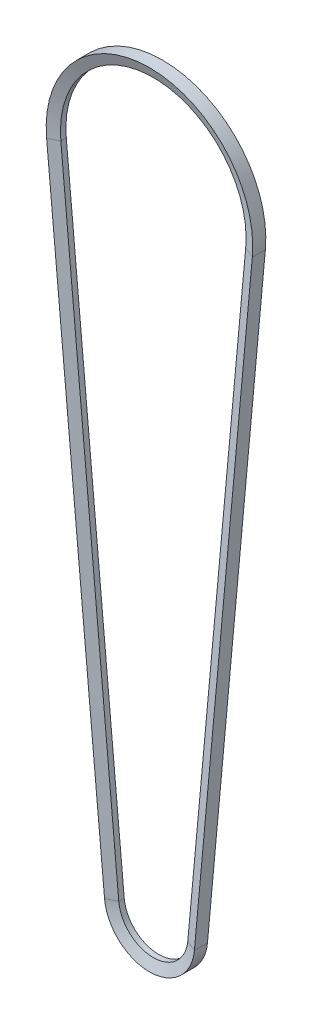
ISO-10303-21;
HEADER;
FILE_DESCRIPTION(('STEP AP214'),'2;1');
FILE_NAME('part.step','',(''),(''),'','','');
FILE_SCHEMA(('AUTOMOTIVE_DESIGN { 1 0 10303 214 1 1 1 1 }'));
ENDSEC;
DATA;
#1=APPLICATION_CONTEXT('core data for automotive mechanical design processes');
#2=APPLICATION_PROTOCOL_DEFINITION('international standard','automotive_design',2000,#1);
#3=PRODUCT_CONTEXT('',#1,'mechanical');
#4=PRODUCT('Part','Part','',(#3));
#5=PRODUCT_RELATED_PRODUCT_CATEGORY('part','',(#4));
#6=PRODUCT_DEFINITION_FORMATION('','',#4);
#7=PRODUCT_DEFINITION_CONTEXT('part definition',#1,'design');
#8=PRODUCT_DEFINITION('design','',#6,#7);
#9=PRODUCT_DEFINITION_SHAPE('','',#8);
#10=(LENGTH_UNIT() NAMED_UNIT(*) SI_UNIT(.MILLI.,.METRE.));
#11=(NAMED_UNIT(*) PLANE_ANGLE_UNIT() SI_UNIT($,.RADIAN.));
#12=(NAMED_UNIT(*) SI_UNIT($,.STERADIAN.) SOLID_ANGLE_UNIT());
#13=UNCERTAINTY_MEASURE_WITH_UNIT(LENGTH_MEASURE(1.E-05),#10,'distance_accuracy_value','');
#14=(GEOMETRIC_REPRESENTATION_CONTEXT(3) GLOBAL_UNCERTAINTY_ASSIGNED_CONTEXT((#13)) GLOBAL_UNIT_ASSIGNED_CONTEXT((#10,
#11,#12)) REPRESENTATION_CONTEXT('',''));
#15=CARTESIAN_POINT('',(0.,0.,0.));
#16=DIRECTION('',(0.,0.,1.));
#17=DIRECTION('',(1.,0.,0.));
#18=AXIS2_PLACEMENT_3D('',#15,#16,#17);
#19=CARTESIAN_POINT('',(-1.65201186064223E-10,485.500000000071,0.));
#20=DIRECTION('',(0.,0.,-1.));
#21=DIRECTION('',(-1.,0.,0.));
#22=AXIS2_PLACEMENT_3D('',#19,#20,#21);
#23=CYLINDRICAL_SURFACE('',#22,79.);
#24=CARTESIAN_POINT('',(-1.65201186064223E-10,485.500000000071,-5.));
#25=DIRECTION('',(0.,0.,-1.));
#26=DIRECTION('',(-0.995790537992341,-0.091658084449354,0.));
#27=AXIS2_PLACEMENT_3D('',#24,#25,#26);
#28=CIRCLE('',#27,79.);
#29=CARTESIAN_POINT('',(-78.6674525015601,478.259011328572,-5.));
#30=VERTEX_POINT('',#29);
#31=CARTESIAN_POINT('',(78.6674525012348,478.259011328628,-5.));
#32=VERTEX_POINT('',#31);
#33=EDGE_CURVE('E11',#30,#32,#28,.T.);
#34=ORIENTED_EDGE('',*,*,#33,.F.);
#35=DIRECTION('',(0.,0.,1.));
#36=VECTOR('',#35,1.);
#37=CARTESIAN_POINT('',(-78.6674525015601,478.259011328572,-5.));
#38=LINE('',#37,#36);
#39=CARTESIAN_POINT('',(-78.6674525015601,478.259011328572,5.));
#40=VERTEX_POINT('',#39);
#41=EDGE_CURVE('E36',#30,#40,#38,.T.);
#42=ORIENTED_EDGE('',*,*,#41,.T.);
#43=CARTESIAN_POINT('',(-1.65201186064223E-10,485.500000000071,5.));
#44=DIRECTION('',(0.,0.,-1.));
#45=DIRECTION('',(-0.995790537992341,-0.091658084449354,0.));
#46=AXIS2_PLACEMENT_3D('',#43,#44,#45);
#47=CIRCLE('',#46,79.);
#48=CARTESIAN_POINT('',(78.6674525012348,478.259011328628,5.));
#49=VERTEX_POINT('',#48);
#50=EDGE_CURVE('E118',#40,#49,#47,.T.);
#51=ORIENTED_EDGE('',*,*,#50,.T.);
#52=DIRECTION('',(0.,0.,1.));
#53=VECTOR('',#52,1.);
#54=CARTESIAN_POINT('',(78.6674525012348,478.259011328628,-5.));
#55=LINE('',#54,#53);
#56=EDGE_CURVE('E121',#32,#49,#55,.T.);
#57=ORIENTED_EDGE('',*,*,#56,.F.);
#58=EDGE_LOOP('',(#34,#42,#51,#57));
#59=FACE_BOUND('',#58,.T.);
#60=ADVANCED_FACE('F33',(#59),#23,.T.);
#61=CARTESIAN_POINT('',(-1.65201186064223E-10,485.500000000071,-2.08823812587041));
#62=DIRECTION('',(0.,0.,-1.));
#63=DIRECTION('',(-1.,0.,0.));
#64=AXIS2_PLACEMENT_3D('',#61,#62,#63);
#65=CONICAL_SURFACE('',#64,71.,1.22173047639603);
#66=CARTESIAN_POINT('',(-1.65201186064223E-10,485.500000000071,-2.08823812587041));
#67=DIRECTION('',(0.,0.,-1.));
#68=DIRECTION('',(-0.995790537992341,-0.0916580844493543,0.));
#69=AXIS2_PLACEMENT_3D('',#66,#67,#68);
#70=CIRCLE('',#69,71.);
#71=CARTESIAN_POINT('',(-70.7011281976214,478.992276004167,-2.08823812587041));
#72=VERTEX_POINT('',#71);
#73=CARTESIAN_POINT('',(70.7011281972955,478.992276004217,-2.08823812587041));
#74=VERTEX_POINT('',#73);
#75=EDGE_CURVE('E41',#72,#74,#70,.T.);
#76=ORIENTED_EDGE('',*,*,#75,.F.);
#77=DIRECTION('',(-0.935737020399833,-0.0861304255924296,-0.342020143325666));
#78=VECTOR('',#77,1.);
#79=CARTESIAN_POINT('',(-70.7011281976214,478.992276004167,-2.08823812587041));
#80=LINE('',#79,#78);
#81=EDGE_CURVE('E187',#72,#30,#80,.T.);
#82=ORIENTED_EDGE('',*,*,#81,.T.);
#83=ORIENTED_EDGE('',*,*,#33,.T.);
#84=DIRECTION('',(0.935737020399894,-0.0861304255917754,-0.342020143325666));
#85=VECTOR('',#84,1.);
#86=CARTESIAN_POINT('',(70.7011281972955,478.992276004217,-2.08823812587041));
#87=LINE('',#86,#85);
#88=EDGE_CURVE('E146',#74,#32,#87,.T.);
#89=ORIENTED_EDGE('',*,*,#88,.F.);
#90=EDGE_LOOP('',(#76,#82,#83,#89));
#91=FACE_BOUND('',#90,.T.);
#92=ADVANCED_FACE('F227',(#91),#65,.F.);
#93=CARTESIAN_POINT('',(-1.65201186064223E-10,485.500000000071,0.));
#94=DIRECTION('',(0.,0.,-1.));
#95=DIRECTION('',(-1.,0.,0.));
#96=AXIS2_PLACEMENT_3D('',#93,#94,#95);
#97=CYLINDRICAL_SURFACE('',#96,71.);
#98=CARTESIAN_POINT('',(-1.65201186064223E-10,485.500000000071,2.08823812587041));
#99=DIRECTION('',(0.,0.,-1.));
#100=DIRECTION('',(-0.995790537992341,-0.0916580844493543,0.));
#101=AXIS2_PLACEMENT_3D('',#98,#99,#100);
#102=CIRCLE('',#101,71.);
#103=CARTESIAN_POINT('',(-70.7011281976214,478.992276004167,2.08823812587041));
#104=VERTEX_POINT('',#103);
#105=CARTESIAN_POINT('',(70.7011281972955,478.992276004217,2.08823812587041));
#106=VERTEX_POINT('',#105);
#107=EDGE_CURVE('E127',#104,#106,#102,.T.);
#108=ORIENTED_EDGE('',*,*,#107,.F.);
#109=DIRECTION('',(0.,0.,-1.));
#110=VECTOR('',#109,1.);
#111=CARTESIAN_POINT('',(-70.7011281976214,478.992276004167,2.08823812587041));
#112=LINE('',#111,#110);
#113=EDGE_CURVE('E171',#104,#72,#112,.T.);
#114=ORIENTED_EDGE('',*,*,#113,.T.);
#115=ORIENTED_EDGE('',*,*,#75,.T.);
#116=DIRECTION('',(0.,0.,-1.));
#117=VECTOR('',#116,1.);
#118=CARTESIAN_POINT('',(70.7011281972955,478.992276004217,2.08823812587041));
#119=LINE('',#118,#117);
#120=EDGE_CURVE('E151',#106,#74,#119,.T.);
#121=ORIENTED_EDGE('',*,*,#120,.F.);
#122=EDGE_LOOP('',(#108,#114,#115,#121));
#123=FACE_BOUND('',#122,.T.);
#124=ADVANCED_FACE('F223',(#123),#97,.F.);
#125=CARTESIAN_POINT('',(-34.3547735607316,-3.16220391351518,-5.));
#126=DIRECTION('',(-0.995790537992341,-0.0916580844493531,0.));
#127=DIRECTION('',(0.0916580844493531,-0.995790537992341,0.));
#128=AXIS2_PLACEMENT_3D('',#125,#126,#127);
#129=PLANE('',#128);
#130=ORIENTED_EDGE('',*,*,#41,.F.);
#131=DIRECTION('',(-0.0916580844493531,0.995790537992341,0.));
#132=VECTOR('',#131,1.);
#133=CARTESIAN_POINT('',(-34.3547735607316,-3.16220391351518,-5.));
#134=LINE('',#133,#132);
#135=CARTESIAN_POINT('',(-34.3547735607317,-3.16220391351519,-5.));
#136=VERTEX_POINT('',#135);
#137=EDGE_CURVE('E49',#136,#30,#134,.T.);
#138=ORIENTED_EDGE('',*,*,#137,.F.);
#139=DIRECTION('',(0.,0.,1.));
#140=VECTOR('',#139,1.);
#141=CARTESIAN_POINT('',(-34.3547735607316,-3.16220391351518,-5.));
#142=LINE('',#141,#140);
#143=CARTESIAN_POINT('',(-34.3547735607317,-3.16220391351519,5.));
#144=VERTEX_POINT('',#143);
#145=EDGE_CURVE('E175',#136,#144,#142,.T.);
#146=ORIENTED_EDGE('',*,*,#145,.T.);
#147=DIRECTION('',(-0.0916580844493531,0.995790537992341,0.));
#148=VECTOR('',#147,1.);
#149=CARTESIAN_POINT('',(-34.3547735607316,-3.16220391351518,5.));
#150=LINE('',#149,#148);
#151=EDGE_CURVE('E173',#144,#40,#150,.T.);
#152=ORIENTED_EDGE('',*,*,#151,.T.);
#153=EDGE_LOOP('',(#130,#138,#146,#152));
#154=FACE_BOUND('',#153,.T.);
#155=ADVANCED_FACE('F202',(#154),#129,.T.);
#156=CARTESIAN_POINT('',(-26.3884492567929,-2.42893923792037,-2.08823812587041));
#157=DIRECTION('',(0.340580422526482,0.0313489111803237,-0.93969262078591));
#158=DIRECTION('',(-0.940154704850137,0.,-0.340747899403874));
#159=AXIS2_PLACEMENT_3D('',#156,#157,#158);
#160=PLANE('',#159);
#161=ORIENTED_EDGE('',*,*,#137,.T.);
#162=ORIENTED_EDGE('',*,*,#81,.F.);
#163=DIRECTION('',(-0.0916580844493531,0.995790537992341,0.));
#164=VECTOR('',#163,1.);
#165=CARTESIAN_POINT('',(-26.3884492567929,-2.42893923792037,-2.08823812587041));
#166=LINE('',#165,#164);
#167=CARTESIAN_POINT('',(-26.388449256793,-2.42893923792038,-2.08823812587041));
#168=VERTEX_POINT('',#167);
#169=EDGE_CURVE('E58',#168,#72,#166,.T.);
#170=ORIENTED_EDGE('',*,*,#169,.F.);
#171=DIRECTION('',(-0.935737020399833,-0.0861304255924302,-0.342020143325666));
#172=VECTOR('',#171,1.);
#173=CARTESIAN_POINT('',(-26.3884492567929,-2.42893923792037,-2.08823812587041));
#174=LINE('',#173,#172);
#175=EDGE_CURVE('E184',#168,#136,#174,.T.);
#176=ORIENTED_EDGE('',*,*,#175,.T.);
#177=EDGE_LOOP('',(#161,#162,#170,#176));
#178=FACE_BOUND('',#177,.T.);
#179=ADVANCED_FACE('F213',(#178),#160,.T.);
#180=CARTESIAN_POINT('',(-26.3884492567929,-2.42893923792037,2.08823812587041));
#181=DIRECTION('',(0.995790537992341,0.0916580844493531,0.));
#182=DIRECTION('',(-0.0916580844493531,0.995790537992341,0.));
#183=AXIS2_PLACEMENT_3D('',#180,#181,#182);
#184=PLANE('',#183);
#185=ORIENTED_EDGE('',*,*,#169,.T.);
#186=ORIENTED_EDGE('',*,*,#113,.F.);
#187=DIRECTION('',(-0.0916580844493531,0.995790537992341,0.));
#188=VECTOR('',#187,1.);
#189=CARTESIAN_POINT('',(-26.3884492567929,-2.42893923792037,2.08823812587041));
#190=LINE('',#189,#188);
#191=CARTESIAN_POINT('',(-26.388449256793,-2.42893923792038,2.08823812587041));
#192=VERTEX_POINT('',#191);
#193=EDGE_CURVE('E86',#192,#104,#190,.T.);
#194=ORIENTED_EDGE('',*,*,#193,.F.);
#195=DIRECTION('',(0.,0.,-1.));
#196=VECTOR('',#195,1.);
#197=CARTESIAN_POINT('',(-26.3884492567929,-2.42893923792037,2.08823812587041));
#198=LINE('',#197,#196);
#199=EDGE_CURVE('E165',#192,#168,#198,.T.);
#200=ORIENTED_EDGE('',*,*,#199,.T.);
#201=EDGE_LOOP('',(#185,#186,#194,#200));
#202=FACE_BOUND('',#201,.T.);
#203=ADVANCED_FACE('F215',(#202),#184,.T.);
#204=CARTESIAN_POINT('',(-34.3547735607316,-3.16220391351518,5.));
#205=DIRECTION('',(0.340580422526482,0.0313489111803237,0.939692620785909));
#206=DIRECTION('',(0.940154704850137,0.,-0.340747899403874));
#207=AXIS2_PLACEMENT_3D('',#204,#205,#206);
#208=PLANE('',#207);
#209=ORIENTED_EDGE('',*,*,#193,.T.);
#210=DIRECTION('',(0.935737020399833,0.0861304255924296,-0.342020143325666));
#211=VECTOR('',#210,1.);
#212=CARTESIAN_POINT('',(-78.6674525015601,478.259011328572,5.));
#213=LINE('',#212,#211);
#214=EDGE_CURVE('E169',#40,#104,#213,.T.);
#215=ORIENTED_EDGE('',*,*,#214,.F.);
#216=ORIENTED_EDGE('',*,*,#151,.F.);
#217=DIRECTION('',(0.935737020399833,0.0861304255924302,-0.342020143325666));
#218=VECTOR('',#217,1.);
#219=CARTESIAN_POINT('',(-34.3547735607316,-3.16220391351518,5.));
#220=LINE('',#219,#218);
#221=EDGE_CURVE('E160',#144,#192,#220,.T.);
#222=ORIENTED_EDGE('',*,*,#221,.T.);
#223=EDGE_LOOP('',(#209,#215,#216,#222));
#224=FACE_BOUND('',#223,.T.);
#225=ADVANCED_FACE('F221',(#224),#208,.T.);
#226=CARTESIAN_POINT('',(4.13558076672871E-12,-1.23633742132867E-11,0.));
#227=DIRECTION('',(0.,0.,-1.));
#228=DIRECTION('',(-1.,0.,0.));
#229=AXIS2_PLACEMENT_3D('',#226,#227,#228);
#230=CYLINDRICAL_SURFACE('',#229,34.5000000000001);
#231=ORIENTED_EDGE('',*,*,#145,.F.);
#232=CARTESIAN_POINT('',(4.13558076672871E-12,-1.23633742132867E-11,-5.));
#233=DIRECTION('',(0.,0.,-1.));
#234=DIRECTION('',(0.995790537992405,-0.0916580844486536,0.));
#235=AXIS2_PLACEMENT_3D('',#232,#233,#234);
#236=CIRCLE('',#235,34.5000000000001);
#237=CARTESIAN_POINT('',(34.3547735607421,-3.16220391349092,-5.));
#238=VERTEX_POINT('',#237);
#239=EDGE_CURVE('E194',#238,#136,#236,.T.);
#240=ORIENTED_EDGE('',*,*,#239,.F.);
#241=DIRECTION('',(0.,0.,1.));
#242=VECTOR('',#241,1.);
#243=CARTESIAN_POINT('',(34.3547735607421,-3.16220391349092,-5.));
#244=LINE('',#243,#242);
#245=CARTESIAN_POINT('',(34.3547735607421,-3.16220391349092,5.));
#246=VERTEX_POINT('',#245);
#247=EDGE_CURVE('E168',#238,#246,#244,.T.);
#248=ORIENTED_EDGE('',*,*,#247,.T.);
#249=CARTESIAN_POINT('',(4.13558076672871E-12,-1.23633742132867E-11,5.));
#250=DIRECTION('',(0.,0.,-1.));
#251=DIRECTION('',(0.995790537992405,-0.0916580844486536,0.));
#252=AXIS2_PLACEMENT_3D('',#249,#250,#251);
#253=CIRCLE('',#252,34.5000000000001);
#254=EDGE_CURVE('E163',#246,#144,#253,.T.);
#255=ORIENTED_EDGE('',*,*,#254,.T.);
#256=EDGE_LOOP('',(#231,#240,#248,#255));
#257=FACE_BOUND('',#256,.T.);
#258=ADVANCED_FACE('F207',(#257),#230,.T.);
#259=CARTESIAN_POINT('',(4.13558076672871E-12,-1.23633742132867E-11,-2.08823812587041));
#260=DIRECTION('',(0.,0.,-1.));
#261=DIRECTION('',(-1.,0.,0.));
#262=AXIS2_PLACEMENT_3D('',#259,#260,#261);
#263=CONICAL_SURFACE('',#262,26.5000000000001,1.22173047639603);
#264=ORIENTED_EDGE('',*,*,#239,.T.);
#265=ORIENTED_EDGE('',*,*,#175,.F.);
#266=CARTESIAN_POINT('',(4.13558076672871E-12,-1.23633742132867E-11,-2.08823812587041));
#267=DIRECTION('',(0.,0.,-1.));
#268=DIRECTION('',(0.995790537992405,-0.0916580844486524,0.));
#269=AXIS2_PLACEMENT_3D('',#266,#267,#268);
#270=CIRCLE('',#269,26.5000000000001);
#271=CARTESIAN_POINT('',(26.3884492568029,-2.42893923790166,-2.08823812587041));
#272=VERTEX_POINT('',#271);
#273=EDGE_CURVE('E99',#272,#168,#270,.T.);
#274=ORIENTED_EDGE('',*,*,#273,.F.);
#275=DIRECTION('',(0.935737020399894,-0.0861304255917754,-0.342020143325666));
#276=VECTOR('',#275,1.);
#277=CARTESIAN_POINT('',(26.3884492568029,-2.42893923790166,-2.08823812587041));
#278=LINE('',#277,#276);
#279=EDGE_CURVE('E181',#272,#238,#278,.T.);
#280=ORIENTED_EDGE('',*,*,#279,.T.);
#281=EDGE_LOOP('',(#264,#265,#274,#280));
#282=FACE_BOUND('',#281,.T.);
#283=ADVANCED_FACE('F212',(#282),#263,.F.);
#284=CARTESIAN_POINT('',(4.13558076672871E-12,-1.23633742132867E-11,0.));
#285=DIRECTION('',(0.,0.,-1.));
#286=DIRECTION('',(-1.,0.,0.));
#287=AXIS2_PLACEMENT_3D('',#284,#285,#286);
#288=CYLINDRICAL_SURFACE('',#287,26.5000000000001);
#289=ORIENTED_EDGE('',*,*,#273,.T.);
#290=ORIENTED_EDGE('',*,*,#199,.F.);
#291=CARTESIAN_POINT('',(4.13558076672871E-12,-1.23633742132867E-11,2.08823812587041));
#292=DIRECTION('',(0.,0.,-1.));
#293=DIRECTION('',(0.995790537992405,-0.0916580844486524,0.));
#294=AXIS2_PLACEMENT_3D('',#291,#292,#293);
#295=CIRCLE('',#294,26.5000000000001);
#296=CARTESIAN_POINT('',(26.3884492568029,-2.42893923790166,2.08823812587041));
#297=VERTEX_POINT('',#296);
#298=EDGE_CURVE('E105',#297,#192,#295,.T.);
#299=ORIENTED_EDGE('',*,*,#298,.F.);
#300=DIRECTION('',(0.,0.,-1.));
#301=VECTOR('',#300,1.);
#302=CARTESIAN_POINT('',(26.3884492568029,-2.42893923790166,2.08823812587041));
#303=LINE('',#302,#301);
#304=EDGE_CURVE('E158',#297,#272,#303,.T.);
#305=ORIENTED_EDGE('',*,*,#304,.T.);
#306=EDGE_LOOP('',(#289,#290,#299,#305));
#307=FACE_BOUND('',#306,.T.);
#308=ADVANCED_FACE('F245',(#307),#288,.F.);
#309=CARTESIAN_POINT('',(4.13558076672871E-12,-1.23633742132867E-11,5.));
#310=DIRECTION('',(0.,0.,1.));
#311=DIRECTION('',(1.,0.,0.));
#312=AXIS2_PLACEMENT_3D('',#309,#310,#311);
#313=CONICAL_SURFACE('',#312,34.5000000000001,1.22173047639603);
#314=ORIENTED_EDGE('',*,*,#298,.T.);
#315=ORIENTED_EDGE('',*,*,#221,.F.);
#316=ORIENTED_EDGE('',*,*,#254,.F.);
#317=DIRECTION('',(-0.935737020399893,0.0861304255917754,-0.342020143325666));
#318=VECTOR('',#317,1.);
#319=CARTESIAN_POINT('',(34.3547735607421,-3.16220391349092,5.));
#320=LINE('',#319,#318);
#321=EDGE_CURVE('E138',#246,#297,#320,.T.);
#322=ORIENTED_EDGE('',*,*,#321,.T.);
#323=EDGE_LOOP('',(#314,#315,#316,#322));
#324=FACE_BOUND('',#323,.T.);
#325=ADVANCED_FACE('F205',(#324),#313,.F.);
#326=CARTESIAN_POINT('',(78.6674525012348,478.259011328628,-5.));
#327=DIRECTION('',(0.995790537992405,-0.0916580844486585,0.));
#328=DIRECTION('',(0.0916580844486585,0.995790537992405,0.));
#329=AXIS2_PLACEMENT_3D('',#326,#327,#328);
#330=PLANE('',#329);
#331=ORIENTED_EDGE('',*,*,#247,.F.);
#332=DIRECTION('',(-0.0916580844486585,-0.995790537992405,0.));
#333=VECTOR('',#332,1.);
#334=CARTESIAN_POINT('',(78.6674525012348,478.259011328628,-5.));
#335=LINE('',#334,#333);
#336=EDGE_CURVE('E145',#32,#238,#335,.T.);
#337=ORIENTED_EDGE('',*,*,#336,.F.);
#338=ORIENTED_EDGE('',*,*,#56,.T.);
#339=DIRECTION('',(-0.0916580844486585,-0.995790537992405,0.));
#340=VECTOR('',#339,1.);
#341=CARTESIAN_POINT('',(78.6674525012348,478.259011328628,5.));
#342=LINE('',#341,#340);
#343=EDGE_CURVE('E133',#49,#246,#342,.T.);
#344=ORIENTED_EDGE('',*,*,#343,.T.);
#345=EDGE_LOOP('',(#331,#337,#338,#344));
#346=FACE_BOUND('',#345,.T.);
#347=ADVANCED_FACE('F143',(#346),#330,.T.);
#348=CARTESIAN_POINT('',(70.7011281972955,478.992276004217,-2.08823812587041));
#349=DIRECTION('',(-0.340580422526504,0.0313489111800862,-0.93969262078591));
#350=DIRECTION('',(-0.94015470485013,0.,0.340747899403893));
#351=AXIS2_PLACEMENT_3D('',#348,#349,#350);
#352=PLANE('',#351);
#353=ORIENTED_EDGE('',*,*,#336,.T.);
#354=ORIENTED_EDGE('',*,*,#279,.F.);
#355=DIRECTION('',(-0.0916580844486585,-0.995790537992405,0.));
#356=VECTOR('',#355,1.);
#357=CARTESIAN_POINT('',(70.7011281972955,478.992276004217,-2.08823812587041));
#358=LINE('',#357,#356);
#359=EDGE_CURVE('E178',#74,#272,#358,.T.);
#360=ORIENTED_EDGE('',*,*,#359,.F.);
#361=ORIENTED_EDGE('',*,*,#88,.T.);
#362=EDGE_LOOP('',(#353,#354,#360,#361));
#363=FACE_BOUND('',#362,.T.);
#364=ADVANCED_FACE('F209',(#363),#352,.T.);
#365=CARTESIAN_POINT('',(70.7011281972955,478.992276004217,2.08823812587041));
#366=DIRECTION('',(-0.995790537992405,0.0916580844486585,0.));
#367=DIRECTION('',(-0.0916580844486585,-0.995790537992405,0.));
#368=AXIS2_PLACEMENT_3D('',#365,#366,#367);
#369=PLANE('',#368);
#370=ORIENTED_EDGE('',*,*,#359,.T.);
#371=ORIENTED_EDGE('',*,*,#304,.F.);
#372=DIRECTION('',(-0.0916580844486585,-0.995790537992405,0.));
#373=VECTOR('',#372,1.);
#374=CARTESIAN_POINT('',(70.7011281972955,478.992276004217,2.08823812587041));
#375=LINE('',#374,#373);
#376=EDGE_CURVE('E157',#106,#297,#375,.T.);
#377=ORIENTED_EDGE('',*,*,#376,.F.);
#378=ORIENTED_EDGE('',*,*,#120,.T.);
#379=EDGE_LOOP('',(#370,#371,#377,#378));
#380=FACE_BOUND('',#379,.T.);
#381=ADVANCED_FACE('F254',(#380),#369,.T.);
#382=CARTESIAN_POINT('',(78.6674525012348,478.259011328628,5.));
#383=DIRECTION('',(-0.340580422526504,0.0313489111800862,0.939692620785909));
#384=DIRECTION('',(0.94015470485013,0.,0.340747899403893));
#385=AXIS2_PLACEMENT_3D('',#382,#383,#384);
#386=PLANE('',#385);
#387=ORIENTED_EDGE('',*,*,#376,.T.);
#388=ORIENTED_EDGE('',*,*,#321,.F.);
#389=ORIENTED_EDGE('',*,*,#343,.F.);
#390=DIRECTION('',(-0.935737020399893,0.0861304255917754,-0.342020143325666));
#391=VECTOR('',#390,1.);
#392=CARTESIAN_POINT('',(78.6674525012348,478.259011328628,5.));
#393=LINE('',#392,#391);
#394=EDGE_CURVE('E136',#49,#106,#393,.T.);
#395=ORIENTED_EDGE('',*,*,#394,.T.);
#396=EDGE_LOOP('',(#387,#388,#389,#395));
#397=FACE_BOUND('',#396,.T.);
#398=ADVANCED_FACE('F135',(#397),#386,.T.);
#399=CARTESIAN_POINT('',(-1.65201186064223E-10,485.500000000071,5.));
#400=DIRECTION('',(0.,0.,1.));
#401=DIRECTION('',(1.,0.,0.));
#402=AXIS2_PLACEMENT_3D('',#399,#400,#401);
#403=CONICAL_SURFACE('',#402,79.,1.22173047639603);
#404=ORIENTED_EDGE('',*,*,#214,.T.);
#405=ORIENTED_EDGE('',*,*,#107,.T.);
#406=ORIENTED_EDGE('',*,*,#394,.F.);
#407=ORIENTED_EDGE('',*,*,#50,.F.);
#408=EDGE_LOOP('',(#404,#405,#406,#407));
#409=FACE_BOUND('',#408,.T.);
#410=ADVANCED_FACE('F148',(#409),#403,.F.);
#411=CLOSED_SHELL('',(#60,#92,#124,#155,#179,#203,#225,#258,#283,#308,#325,#347,#364,#381,#398,#410));
#412=MANIFOLD_SOLID_BREP('B2',#411);
#413=ADVANCED_BREP_SHAPE_REPRESENTATION('',(#18,#412),#14);
#414=SHAPE_DEFINITION_REPRESENTATION(#9,#413);
ENDSEC;
END-ISO-10303-21;
